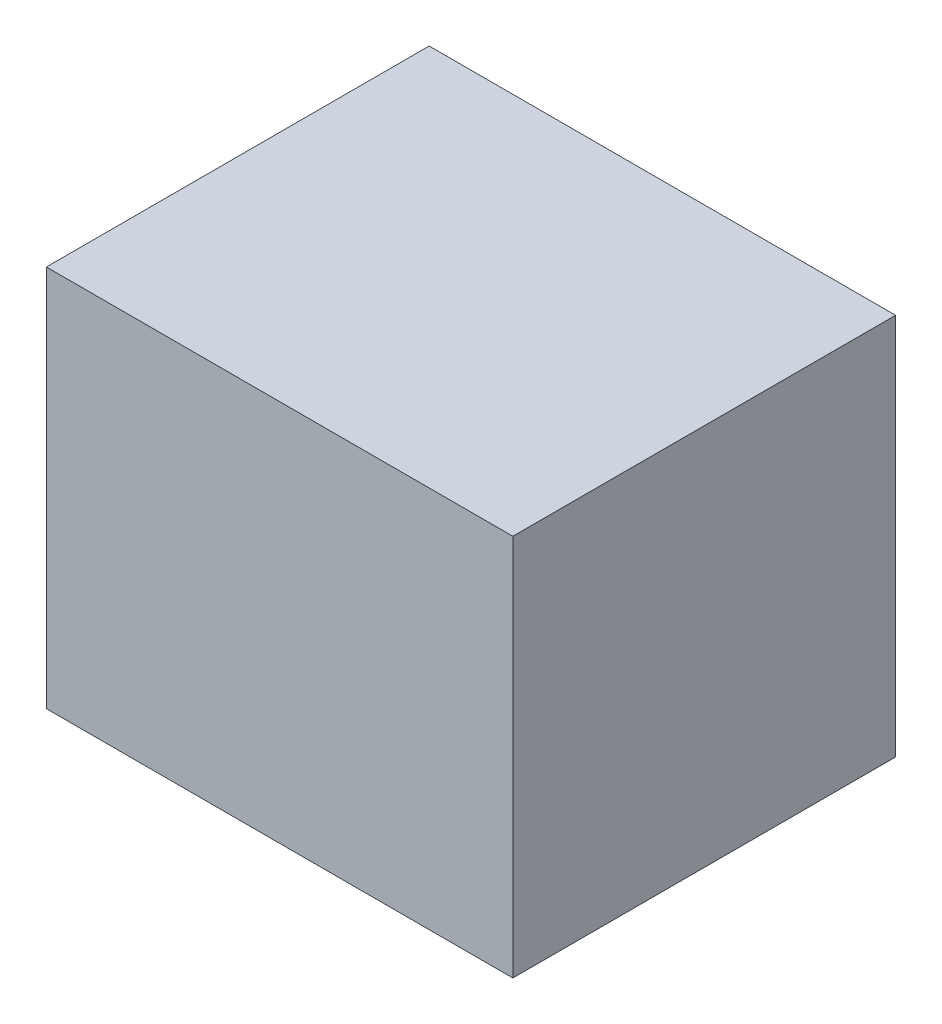
ISO-10303-21;
HEADER;
FILE_DESCRIPTION(('STEP AP214'),'2;1');
FILE_NAME('part.step','',(''),(''),'','','');
FILE_SCHEMA(('AUTOMOTIVE_DESIGN { 1 0 10303 214 1 1 1 1 }'));
ENDSEC;
DATA;
#1=APPLICATION_CONTEXT('core data for automotive mechanical design processes');
#2=APPLICATION_PROTOCOL_DEFINITION('international standard','automotive_design',2000,#1);
#3=PRODUCT_CONTEXT('',#1,'mechanical');
#4=PRODUCT('Part','Part','',(#3));
#5=PRODUCT_RELATED_PRODUCT_CATEGORY('part','',(#4));
#6=PRODUCT_DEFINITION_FORMATION('','',#4);
#7=PRODUCT_DEFINITION_CONTEXT('part definition',#1,'design');
#8=PRODUCT_DEFINITION('design','',#6,#7);
#9=PRODUCT_DEFINITION_SHAPE('','',#8);
#10=(LENGTH_UNIT() NAMED_UNIT(*) SI_UNIT(.MILLI.,.METRE.));
#11=(NAMED_UNIT(*) PLANE_ANGLE_UNIT() SI_UNIT($,.RADIAN.));
#12=(NAMED_UNIT(*) SI_UNIT($,.STERADIAN.) SOLID_ANGLE_UNIT());
#13=UNCERTAINTY_MEASURE_WITH_UNIT(LENGTH_MEASURE(1.E-05),#10,'distance_accuracy_value','');
#14=(GEOMETRIC_REPRESENTATION_CONTEXT(3) GLOBAL_UNCERTAINTY_ASSIGNED_CONTEXT((#13)) GLOBAL_UNIT_ASSIGNED_CONTEXT((#10,
#11,#12)) REPRESENTATION_CONTEXT('',''));
#15=CARTESIAN_POINT('',(0.,0.,0.));
#16=DIRECTION('',(0.,0.,1.));
#17=DIRECTION('',(1.,0.,0.));
#18=AXIS2_PLACEMENT_3D('',#15,#16,#17);
#19=CARTESIAN_POINT('',(0.3048,0.2499995,0.));
#20=DIRECTION('',(0.,-1.,0.));
#21=DIRECTION('',(0.,0.,-1.));
#22=AXIS2_PLACEMENT_3D('',#19,#20,#21);
#23=PLANE('',#22);
#24=DIRECTION('',(0.,0.,-1.));
#25=VECTOR('',#24,1.);
#26=CARTESIAN_POINT('',(-0.3048,0.2499995,0.));
#27=LINE('',#26,#25);
#28=CARTESIAN_POINT('',(-0.3048,0.2499995,0.));
#29=VERTEX_POINT('',#28);
#30=CARTESIAN_POINT('',(-0.3048,0.2499995,0.500253));
#31=VERTEX_POINT('',#30);
#32=EDGE_CURVE('E20',#29,#31,#27,.F.);
#33=ORIENTED_EDGE('',*,*,#32,.T.);
#34=DIRECTION('',(-1.,0.,0.));
#35=VECTOR('',#34,1.);
#36=CARTESIAN_POINT('',(-0.3048,0.2499995,0.500253));
#37=LINE('',#36,#35);
#38=CARTESIAN_POINT('',(0.3048,0.2499995,0.500253));
#39=VERTEX_POINT('',#38);
#40=EDGE_CURVE('E55',#31,#39,#37,.F.);
#41=ORIENTED_EDGE('',*,*,#40,.T.);
#42=DIRECTION('',(0.,0.,1.));
#43=VECTOR('',#42,1.);
#44=CARTESIAN_POINT('',(0.3048,0.2499995,0.));
#45=LINE('',#44,#43);
#46=CARTESIAN_POINT('',(0.3048,0.2499995,0.));
#47=VERTEX_POINT('',#46);
#48=EDGE_CURVE('E74',#39,#47,#45,.F.);
#49=ORIENTED_EDGE('',*,*,#48,.T.);
#50=DIRECTION('',(-1.,0.,0.));
#51=VECTOR('',#50,1.);
#52=CARTESIAN_POINT('',(-0.3048,0.2499995,0.));
#53=LINE('',#52,#51);
#54=EDGE_CURVE('E66',#29,#47,#53,.F.);
#55=ORIENTED_EDGE('',*,*,#54,.F.);
#56=EDGE_LOOP('',(#33,#41,#49,#55));
#57=FACE_BOUND('',#56,.T.);
#58=ADVANCED_FACE('F17',(#57),#23,.F.);
#59=CARTESIAN_POINT('',(-0.3048,0.2499995,0.));
#60=DIRECTION('',(1.,0.,0.));
#61=DIRECTION('',(0.,0.,-1.));
#62=AXIS2_PLACEMENT_3D('',#59,#60,#61);
#63=PLANE('',#62);
#64=DIRECTION('',(0.,0.,1.));
#65=VECTOR('',#64,1.);
#66=CARTESIAN_POINT('',(-0.3048,-0.2499995,0.));
#67=LINE('',#66,#65);
#68=CARTESIAN_POINT('',(-0.3048,-0.2499995,0.));
#69=VERTEX_POINT('',#68);
#70=CARTESIAN_POINT('',(-0.3048,-0.2499995,0.500253));
#71=VERTEX_POINT('',#70);
#72=EDGE_CURVE('E72',#69,#71,#67,.T.);
#73=ORIENTED_EDGE('',*,*,#72,.T.);
#74=DIRECTION('',(0.,1.,0.));
#75=VECTOR('',#74,1.);
#76=CARTESIAN_POINT('',(-0.3048,0.2499995,0.500253));
#77=LINE('',#76,#75);
#78=EDGE_CURVE('E62',#71,#31,#77,.T.);
#79=ORIENTED_EDGE('',*,*,#78,.T.);
#80=ORIENTED_EDGE('',*,*,#32,.F.);
#81=DIRECTION('',(0.,1.,0.));
#82=VECTOR('',#81,1.);
#83=CARTESIAN_POINT('',(-0.3048,0.2499995,0.));
#84=LINE('',#83,#82);
#85=EDGE_CURVE('E80',#69,#29,#84,.T.);
#86=ORIENTED_EDGE('',*,*,#85,.F.);
#87=EDGE_LOOP('',(#73,#79,#80,#86));
#88=FACE_BOUND('',#87,.T.);
#89=ADVANCED_FACE('F71',(#88),#63,.F.);
#90=CARTESIAN_POINT('',(-0.3048,0.2499995,0.500253));
#91=DIRECTION('',(0.,0.,-1.));
#92=DIRECTION('',(-1.,0.,0.));
#93=AXIS2_PLACEMENT_3D('',#90,#91,#92);
#94=PLANE('',#93);
#95=DIRECTION('',(1.,0.,0.));
#96=VECTOR('',#95,1.);
#97=CARTESIAN_POINT('',(-0.3048,-0.2499995,0.500253));
#98=LINE('',#97,#96);
#99=CARTESIAN_POINT('',(0.3048,-0.2499995,0.500253));
#100=VERTEX_POINT('',#99);
#101=EDGE_CURVE('E83',#71,#100,#98,.T.);
#102=ORIENTED_EDGE('',*,*,#101,.T.);
#103=DIRECTION('',(0.,1.,0.));
#104=VECTOR('',#103,1.);
#105=CARTESIAN_POINT('',(0.3048,-0.2499995,0.500253));
#106=LINE('',#105,#104);
#107=EDGE_CURVE('E64',#100,#39,#106,.T.);
#108=ORIENTED_EDGE('',*,*,#107,.T.);
#109=ORIENTED_EDGE('',*,*,#40,.F.);
#110=ORIENTED_EDGE('',*,*,#78,.F.);
#111=EDGE_LOOP('',(#102,#108,#109,#110));
#112=FACE_BOUND('',#111,.T.);
#113=ADVANCED_FACE('F60',(#112),#94,.F.);
#114=CARTESIAN_POINT('',(0.3048,-0.2499995,0.));
#115=DIRECTION('',(-1.,0.,0.));
#116=DIRECTION('',(0.,0.,1.));
#117=AXIS2_PLACEMENT_3D('',#114,#115,#116);
#118=PLANE('',#117);
#119=ORIENTED_EDGE('',*,*,#48,.F.);
#120=ORIENTED_EDGE('',*,*,#107,.F.);
#121=DIRECTION('',(0.,0.,1.));
#122=VECTOR('',#121,1.);
#123=CARTESIAN_POINT('',(0.3048,-0.2499995,0.));
#124=LINE('',#123,#122);
#125=CARTESIAN_POINT('',(0.3048,-0.2499995,0.));
#126=VERTEX_POINT('',#125);
#127=EDGE_CURVE('E26',#100,#126,#124,.F.);
#128=ORIENTED_EDGE('',*,*,#127,.T.);
#129=DIRECTION('',(0.,1.,0.));
#130=VECTOR('',#129,1.);
#131=CARTESIAN_POINT('',(0.3048,0.2499995,0.));
#132=LINE('',#131,#130);
#133=EDGE_CURVE('E34',#47,#126,#132,.F.);
#134=ORIENTED_EDGE('',*,*,#133,.F.);
#135=EDGE_LOOP('',(#119,#120,#128,#134));
#136=FACE_BOUND('',#135,.T.);
#137=ADVANCED_FACE('F88',(#136),#118,.F.);
#138=CARTESIAN_POINT('',(-0.3048,0.2499995,0.));
#139=DIRECTION('',(0.,0.,-1.));
#140=DIRECTION('',(-1.,0.,0.));
#141=AXIS2_PLACEMENT_3D('',#138,#139,#140);
#142=PLANE('',#141);
#143=DIRECTION('',(1.,0.,0.));
#144=VECTOR('',#143,1.);
#145=CARTESIAN_POINT('',(-0.3048,-0.2499995,0.));
#146=LINE('',#145,#144);
#147=EDGE_CURVE('E11',#126,#69,#146,.F.);
#148=ORIENTED_EDGE('',*,*,#147,.T.);
#149=ORIENTED_EDGE('',*,*,#85,.T.);
#150=ORIENTED_EDGE('',*,*,#54,.T.);
#151=ORIENTED_EDGE('',*,*,#133,.T.);
#152=EDGE_LOOP('',(#148,#149,#150,#151));
#153=FACE_BOUND('',#152,.T.);
#154=ADVANCED_FACE('F91',(#153),#142,.T.);
#155=CARTESIAN_POINT('',(-0.3048,-0.2499995,0.));
#156=DIRECTION('',(0.,1.,0.));
#157=DIRECTION('',(0.,0.,1.));
#158=AXIS2_PLACEMENT_3D('',#155,#156,#157);
#159=PLANE('',#158);
#160=ORIENTED_EDGE('',*,*,#127,.F.);
#161=ORIENTED_EDGE('',*,*,#101,.F.);
#162=ORIENTED_EDGE('',*,*,#72,.F.);
#163=ORIENTED_EDGE('',*,*,#147,.F.);
#164=EDGE_LOOP('',(#160,#161,#162,#163));
#165=FACE_BOUND('',#164,.T.);
#166=ADVANCED_FACE('F90',(#165),#159,.F.);
#167=CLOSED_SHELL('',(#58,#89,#113,#137,#154,#166));
#168=MANIFOLD_SOLID_BREP('B1',#167);
#169=ADVANCED_BREP_SHAPE_REPRESENTATION('',(#18,#168),#14);
#170=SHAPE_DEFINITION_REPRESENTATION(#9,#169);
ENDSEC;
END-ISO-10303-21;
